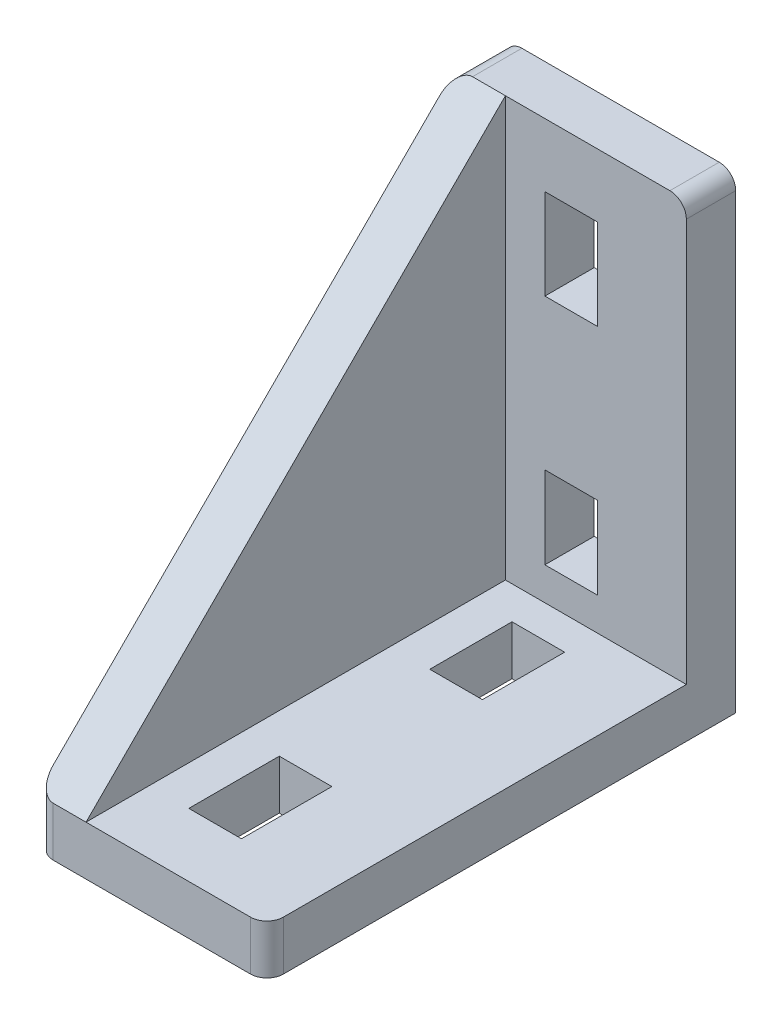
ISO-10303-21;
HEADER;
FILE_DESCRIPTION(('STEP AP214'),'2;1');
FILE_NAME('part.step','',(''),(''),'','','');
FILE_SCHEMA(('AUTOMOTIVE_DESIGN { 1 0 10303 214 1 1 1 1 }'));
ENDSEC;
DATA;
#1=APPLICATION_CONTEXT('core data for automotive mechanical design processes');
#2=APPLICATION_PROTOCOL_DEFINITION('international standard','automotive_design',2000,#1);
#3=PRODUCT_CONTEXT('',#1,'mechanical');
#4=PRODUCT('Part','Part','',(#3));
#5=PRODUCT_RELATED_PRODUCT_CATEGORY('part','',(#4));
#6=PRODUCT_DEFINITION_FORMATION('','',#4);
#7=PRODUCT_DEFINITION_CONTEXT('part definition',#1,'design');
#8=PRODUCT_DEFINITION('design','',#6,#7);
#9=PRODUCT_DEFINITION_SHAPE('','',#8);
#10=(LENGTH_UNIT() NAMED_UNIT(*) SI_UNIT(.MILLI.,.METRE.));
#11=(NAMED_UNIT(*) PLANE_ANGLE_UNIT() SI_UNIT($,.RADIAN.));
#12=(NAMED_UNIT(*) SI_UNIT($,.STERADIAN.) SOLID_ANGLE_UNIT());
#13=UNCERTAINTY_MEASURE_WITH_UNIT(LENGTH_MEASURE(1.E-05),#10,'distance_accuracy_value','');
#14=(GEOMETRIC_REPRESENTATION_CONTEXT(3) GLOBAL_UNCERTAINTY_ASSIGNED_CONTEXT((#13)) GLOBAL_UNIT_ASSIGNED_CONTEXT((#10,
#11,#12)) REPRESENTATION_CONTEXT('',''));
#15=CARTESIAN_POINT('',(0.,0.,0.));
#16=DIRECTION('',(0.,0.,1.));
#17=DIRECTION('',(1.,0.,0.));
#18=AXIS2_PLACEMENT_3D('',#15,#16,#17);
#19=CARTESIAN_POINT('',(28.,3.,3.));
#20=DIRECTION('',(0.,-0.707106781186547,-0.707106781186547));
#21=DIRECTION('',(0.,0.707106781186548,-0.707106781186548));
#22=AXIS2_PLACEMENT_3D('',#19,#20,#21);
#23=PLANE('',#22);
#24=DIRECTION('',(-1.,0.,0.));
#25=VECTOR('',#24,1.);
#26=CARTESIAN_POINT('',(28.,57.,-51.));
#27=LINE('',#26,#25);
#28=CARTESIAN_POINT('',(6.,57.,-51.));
#29=VERTEX_POINT('',#28);
#30=CARTESIAN_POINT('',(2.,57.,-51.));
#31=VERTEX_POINT('',#30);
#32=EDGE_CURVE('E468',#29,#31,#27,.T.);
#33=ORIENTED_EDGE('',*,*,#32,.T.);
#34=CARTESIAN_POINT('',(2.,55.,-49.));
#35=DIRECTION('',(0.,-0.707106781186547,-0.707106781186547));
#36=DIRECTION('',(0.,-0.707106781186548,0.707106781186548));
#37=AXIS2_PLACEMENT_3D('',#34,#35,#36);
#38=ELLIPSE('',#37,2.82842712474619,2.);
#39=CARTESIAN_POINT('',(0.,55.,-49.));
#40=VERTEX_POINT('',#39);
#41=EDGE_CURVE('E482',#31,#40,#38,.F.);
#42=ORIENTED_EDGE('',*,*,#41,.T.);
#43=DIRECTION('',(0.,-0.707106781186548,0.707106781186548));
#44=VECTOR('',#43,1.);
#45=CARTESIAN_POINT('',(0.,3.,3.));
#46=LINE('',#45,#44);
#47=CARTESIAN_POINT('',(0.,8.,-2.));
#48=VERTEX_POINT('',#47);
#49=EDGE_CURVE('E421',#40,#48,#46,.T.);
#50=ORIENTED_EDGE('',*,*,#49,.T.);
#51=CARTESIAN_POINT('',(2.,8.,-2.));
#52=DIRECTION('',(0.,-0.707106781186547,-0.707106781186547));
#53=DIRECTION('',(0.,-0.707106781186548,0.707106781186548));
#54=AXIS2_PLACEMENT_3D('',#51,#52,#53);
#55=ELLIPSE('',#54,2.82842712474619,2.);
#56=CARTESIAN_POINT('',(2.,5.99999999999999,0.));
#57=VERTEX_POINT('',#56);
#58=EDGE_CURVE('E479',#48,#57,#55,.F.);
#59=ORIENTED_EDGE('',*,*,#58,.T.);
#60=DIRECTION('',(-1.,0.,0.));
#61=VECTOR('',#60,1.);
#62=CARTESIAN_POINT('',(28.,5.99999999999999,0.));
#63=LINE('',#62,#61);
#64=CARTESIAN_POINT('',(6.,5.99999999999999,0.));
#65=VERTEX_POINT('',#64);
#66=EDGE_CURVE('E464',#65,#57,#63,.T.);
#67=ORIENTED_EDGE('',*,*,#66,.F.);
#68=DIRECTION('',(0.,-0.707106781186548,0.707106781186548));
#69=VECTOR('',#68,1.);
#70=CARTESIAN_POINT('',(6.,3.,3.));
#71=LINE('',#70,#69);
#72=EDGE_CURVE('E371',#29,#65,#71,.T.);
#73=ORIENTED_EDGE('',*,*,#72,.F.);
#74=EDGE_LOOP('',(#33,#42,#50,#59,#67,#73));
#75=FACE_BOUND('',#74,.T.);
#76=ADVANCED_FACE('F49',(#75),#23,.F.);
#77=CARTESIAN_POINT('',(28.,57.,0.));
#78=DIRECTION('',(0.,-1.,0.));
#79=DIRECTION('',(0.,0.,-1.));
#80=AXIS2_PLACEMENT_3D('',#77,#78,#79);
#81=PLANE('',#80);
#82=DIRECTION('',(-1.,0.,0.));
#83=VECTOR('',#82,1.);
#84=CARTESIAN_POINT('',(28.,57.,-57.));
#85=LINE('',#84,#83);
#86=CARTESIAN_POINT('',(26.,57.,-57.));
#87=VERTEX_POINT('',#86);
#88=CARTESIAN_POINT('',(2.,57.,-57.));
#89=VERTEX_POINT('',#88);
#90=EDGE_CURVE('E443',#87,#89,#85,.T.);
#91=ORIENTED_EDGE('',*,*,#90,.T.);
#92=DIRECTION('',(0.,0.,1.));
#93=VECTOR('',#92,1.);
#94=CARTESIAN_POINT('',(2.,57.,0.));
#95=LINE('',#94,#93);
#96=EDGE_CURVE('E475',#89,#31,#95,.T.);
#97=ORIENTED_EDGE('',*,*,#96,.T.);
#98=ORIENTED_EDGE('',*,*,#32,.F.);
#99=CARTESIAN_POINT('',(26.,57.,-51.));
#100=VERTEX_POINT('',#99);
#101=EDGE_CURVE('E469',#100,#29,#27,.T.);
#102=ORIENTED_EDGE('',*,*,#101,.F.);
#103=DIRECTION('',(0.,0.,1.));
#104=VECTOR('',#103,1.);
#105=CARTESIAN_POINT('',(26.,57.,-57.));
#106=LINE('',#105,#104);
#107=EDGE_CURVE('E472',#100,#87,#106,.F.);
#108=ORIENTED_EDGE('',*,*,#107,.T.);
#109=EDGE_LOOP('',(#91,#97,#98,#102,#108));
#110=FACE_BOUND('',#109,.T.);
#111=ADVANCED_FACE('F537',(#110),#81,.F.);
#112=CARTESIAN_POINT('',(28.,0.,0.));
#113=DIRECTION('',(0.,0.,-1.));
#114=DIRECTION('',(-1.,0.,0.));
#115=AXIS2_PLACEMENT_3D('',#112,#113,#114);
#116=PLANE('',#115);
#117=ORIENTED_EDGE('',*,*,#66,.T.);
#118=DIRECTION('',(0.,-1.,0.));
#119=VECTOR('',#118,1.);
#120=CARTESIAN_POINT('',(2.,0.,0.));
#121=LINE('',#120,#119);
#122=CARTESIAN_POINT('',(2.,0.,0.));
#123=VERTEX_POINT('',#122);
#124=EDGE_CURVE('E510',#57,#123,#121,.T.);
#125=ORIENTED_EDGE('',*,*,#124,.T.);
#126=DIRECTION('',(-1.,0.,0.));
#127=VECTOR('',#126,1.);
#128=CARTESIAN_POINT('',(28.,0.,0.));
#129=LINE('',#128,#127);
#130=CARTESIAN_POINT('',(26.,0.,0.));
#131=VERTEX_POINT('',#130);
#132=EDGE_CURVE('E460',#131,#123,#129,.T.);
#133=ORIENTED_EDGE('',*,*,#132,.F.);
#134=DIRECTION('',(0.,-1.,0.));
#135=VECTOR('',#134,1.);
#136=CARTESIAN_POINT('',(26.,5.99999999999999,0.));
#137=LINE('',#136,#135);
#138=CARTESIAN_POINT('',(26.,5.99999999999999,0.));
#139=VERTEX_POINT('',#138);
#140=EDGE_CURVE('E65',#131,#139,#137,.F.);
#141=ORIENTED_EDGE('',*,*,#140,.T.);
#142=EDGE_CURVE('E465',#139,#65,#63,.T.);
#143=ORIENTED_EDGE('',*,*,#142,.T.);
#144=EDGE_LOOP('',(#117,#125,#133,#141,#143));
#145=FACE_BOUND('',#144,.T.);
#146=ADVANCED_FACE('F530',(#145),#116,.F.);
#147=CARTESIAN_POINT('',(28.,0.,0.));
#148=DIRECTION('',(0.,1.,0.));
#149=DIRECTION('',(0.,0.,1.));
#150=AXIS2_PLACEMENT_3D('',#147,#148,#149);
#151=PLANE('',#150);
#152=DIRECTION('',(1.,0.,0.));
#153=VECTOR('',#152,1.);
#154=CARTESIAN_POINT('',(10.8,0.,-47.));
#155=LINE('',#154,#153);
#156=CARTESIAN_POINT('',(10.8,0.,-47.));
#157=VERTEX_POINT('',#156);
#158=CARTESIAN_POINT('',(17.2,0.,-47.));
#159=VERTEX_POINT('',#158);
#160=EDGE_CURVE('E257',#157,#159,#155,.T.);
#161=ORIENTED_EDGE('',*,*,#160,.F.);
#162=DIRECTION('',(0.,0.,-1.));
#163=VECTOR('',#162,1.);
#164=CARTESIAN_POINT('',(10.8,0.,-47.));
#165=LINE('',#164,#163);
#166=CARTESIAN_POINT('',(10.8,0.,-37.));
#167=VERTEX_POINT('',#166);
#168=EDGE_CURVE('E233',#167,#157,#165,.T.);
#169=ORIENTED_EDGE('',*,*,#168,.F.);
#170=DIRECTION('',(-1.,0.,0.));
#171=VECTOR('',#170,1.);
#172=CARTESIAN_POINT('',(10.8,0.,-37.));
#173=LINE('',#172,#171);
#174=CARTESIAN_POINT('',(17.2,0.,-37.));
#175=VERTEX_POINT('',#174);
#176=EDGE_CURVE('E246',#175,#167,#173,.T.);
#177=ORIENTED_EDGE('',*,*,#176,.F.);
#178=DIRECTION('',(0.,0.,1.));
#179=VECTOR('',#178,1.);
#180=CARTESIAN_POINT('',(17.2,0.,-47.));
#181=LINE('',#180,#179);
#182=EDGE_CURVE('E264',#159,#175,#181,.T.);
#183=ORIENTED_EDGE('',*,*,#182,.F.);
#184=EDGE_LOOP('',(#161,#169,#177,#183));
#185=FACE_BOUND('',#184,.T.);
#186=DIRECTION('',(1.,0.,0.));
#187=VECTOR('',#186,1.);
#188=CARTESIAN_POINT('',(10.8,0.,-18.7));
#189=LINE('',#188,#187);
#190=CARTESIAN_POINT('',(10.8,0.,-18.7));
#191=VERTEX_POINT('',#190);
#192=CARTESIAN_POINT('',(17.2,0.,-18.7));
#193=VERTEX_POINT('',#192);
#194=EDGE_CURVE('E320',#191,#193,#189,.T.);
#195=ORIENTED_EDGE('',*,*,#194,.F.);
#196=DIRECTION('',(0.,0.,-1.));
#197=VECTOR('',#196,1.);
#198=CARTESIAN_POINT('',(10.8,0.,-18.7));
#199=LINE('',#198,#197);
#200=CARTESIAN_POINT('',(10.8,0.,-7.70000000000001));
#201=VERTEX_POINT('',#200);
#202=EDGE_CURVE('E316',#201,#191,#199,.T.);
#203=ORIENTED_EDGE('',*,*,#202,.F.);
#204=DIRECTION('',(-1.,0.,0.));
#205=VECTOR('',#204,1.);
#206=CARTESIAN_POINT('',(10.8,0.,-7.70000000000001));
#207=LINE('',#206,#205);
#208=CARTESIAN_POINT('',(17.2,0.,-7.70000000000001));
#209=VERTEX_POINT('',#208);
#210=EDGE_CURVE('E284',#209,#201,#207,.T.);
#211=ORIENTED_EDGE('',*,*,#210,.F.);
#212=DIRECTION('',(0.,0.,1.));
#213=VECTOR('',#212,1.);
#214=CARTESIAN_POINT('',(17.2,0.,-18.7));
#215=LINE('',#214,#213);
#216=EDGE_CURVE('E324',#193,#209,#215,.T.);
#217=ORIENTED_EDGE('',*,*,#216,.F.);
#218=EDGE_LOOP('',(#195,#203,#211,#217));
#219=FACE_BOUND('',#218,.T.);
#220=ORIENTED_EDGE('',*,*,#132,.T.);
#221=CARTESIAN_POINT('',(2.,0.,-2.));
#222=DIRECTION('',(0.,1.,0.));
#223=DIRECTION('',(0.,0.,1.));
#224=AXIS2_PLACEMENT_3D('',#221,#222,#223);
#225=CIRCLE('',#224,2.);
#226=CARTESIAN_POINT('',(0.,0.,-2.));
#227=VERTEX_POINT('',#226);
#228=EDGE_CURVE('E58',#123,#227,#225,.F.);
#229=ORIENTED_EDGE('',*,*,#228,.T.);
#230=DIRECTION('',(0.,0.,-1.));
#231=VECTOR('',#230,1.);
#232=CARTESIAN_POINT('',(0.,0.,0.));
#233=LINE('',#232,#231);
#234=CARTESIAN_POINT('',(0.,0.,-57.));
#235=VERTEX_POINT('',#234);
#236=EDGE_CURVE('E447',#227,#235,#233,.T.);
#237=ORIENTED_EDGE('',*,*,#236,.T.);
#238=DIRECTION('',(-1.,0.,0.));
#239=VECTOR('',#238,1.);
#240=CARTESIAN_POINT('',(28.,0.,-57.));
#241=LINE('',#240,#239);
#242=CARTESIAN_POINT('',(28.,0.,-57.));
#243=VERTEX_POINT('',#242);
#244=EDGE_CURVE('E456',#243,#235,#241,.T.);
#245=ORIENTED_EDGE('',*,*,#244,.F.);
#246=DIRECTION('',(0.,0.,-1.));
#247=VECTOR('',#246,1.);
#248=CARTESIAN_POINT('',(28.,0.,0.));
#249=LINE('',#248,#247);
#250=CARTESIAN_POINT('',(28.,0.,-2.));
#251=VERTEX_POINT('',#250);
#252=EDGE_CURVE('E435',#251,#243,#249,.T.);
#253=ORIENTED_EDGE('',*,*,#252,.F.);
#254=CARTESIAN_POINT('',(26.,0.,-2.));
#255=DIRECTION('',(0.,1.,0.));
#256=DIRECTION('',(0.,0.,1.));
#257=AXIS2_PLACEMENT_3D('',#254,#255,#256);
#258=CIRCLE('',#257,2.);
#259=EDGE_CURVE('E513',#251,#131,#258,.F.);
#260=ORIENTED_EDGE('',*,*,#259,.T.);
#261=EDGE_LOOP('',(#220,#229,#237,#245,#253,#260));
#262=FACE_BOUND('',#261,.T.);
#263=ADVANCED_FACE('F254',(#185,#219,#262),#151,.F.);
#264=CARTESIAN_POINT('',(28.,0.,-57.));
#265=DIRECTION('',(0.,0.,1.));
#266=DIRECTION('',(1.,0.,0.));
#267=AXIS2_PLACEMENT_3D('',#264,#265,#266);
#268=PLANE('',#267);
#269=DIRECTION('',(1.,0.,0.));
#270=VECTOR('',#269,1.);
#271=CARTESIAN_POINT('',(10.8,49.3,-57.));
#272=LINE('',#271,#270);
#273=CARTESIAN_POINT('',(10.8,49.3,-57.));
#274=VERTEX_POINT('',#273);
#275=CARTESIAN_POINT('',(17.2,49.3,-57.));
#276=VERTEX_POINT('',#275);
#277=EDGE_CURVE('E330',#274,#276,#272,.T.);
#278=ORIENTED_EDGE('',*,*,#277,.F.);
#279=DIRECTION('',(0.,1.,0.));
#280=VECTOR('',#279,1.);
#281=CARTESIAN_POINT('',(10.8,49.3,-57.));
#282=LINE('',#281,#280);
#283=CARTESIAN_POINT('',(10.8,38.3,-57.));
#284=VERTEX_POINT('',#283);
#285=EDGE_CURVE('E335',#284,#274,#282,.T.);
#286=ORIENTED_EDGE('',*,*,#285,.F.);
#287=DIRECTION('',(-1.,0.,0.));
#288=VECTOR('',#287,1.);
#289=CARTESIAN_POINT('',(10.8,38.3,-57.));
#290=LINE('',#289,#288);
#291=CARTESIAN_POINT('',(17.2,38.3,-57.));
#292=VERTEX_POINT('',#291);
#293=EDGE_CURVE('E358',#292,#284,#290,.T.);
#294=ORIENTED_EDGE('',*,*,#293,.F.);
#295=DIRECTION('',(0.,-1.,0.));
#296=VECTOR('',#295,1.);
#297=CARTESIAN_POINT('',(17.2,49.3,-57.));
#298=LINE('',#297,#296);
#299=EDGE_CURVE('E327',#276,#292,#298,.T.);
#300=ORIENTED_EDGE('',*,*,#299,.F.);
#301=EDGE_LOOP('',(#278,#286,#294,#300));
#302=FACE_BOUND('',#301,.T.);
#303=DIRECTION('',(1.,0.,0.));
#304=VECTOR('',#303,1.);
#305=CARTESIAN_POINT('',(10.8,20.,-57.));
#306=LINE('',#305,#304);
#307=CARTESIAN_POINT('',(10.8,20.,-57.));
#308=VERTEX_POINT('',#307);
#309=CARTESIAN_POINT('',(17.2,20.,-57.));
#310=VERTEX_POINT('',#309);
#311=EDGE_CURVE('E407',#308,#310,#306,.T.);
#312=ORIENTED_EDGE('',*,*,#311,.F.);
#313=DIRECTION('',(0.,1.,0.));
#314=VECTOR('',#313,1.);
#315=CARTESIAN_POINT('',(10.8,20.,-57.));
#316=LINE('',#315,#314);
#317=CARTESIAN_POINT('',(10.8,10.,-57.));
#318=VERTEX_POINT('',#317);
#319=EDGE_CURVE('E403',#318,#308,#316,.T.);
#320=ORIENTED_EDGE('',*,*,#319,.F.);
#321=DIRECTION('',(-1.,0.,0.));
#322=VECTOR('',#321,1.);
#323=CARTESIAN_POINT('',(10.8,10.,-57.));
#324=LINE('',#323,#322);
#325=CARTESIAN_POINT('',(17.2,10.,-57.));
#326=VERTEX_POINT('',#325);
#327=EDGE_CURVE('E251',#326,#318,#324,.T.);
#328=ORIENTED_EDGE('',*,*,#327,.F.);
#329=DIRECTION('',(0.,-1.,0.));
#330=VECTOR('',#329,1.);
#331=CARTESIAN_POINT('',(17.2,20.,-57.));
#332=LINE('',#331,#330);
#333=EDGE_CURVE('E331',#310,#326,#332,.T.);
#334=ORIENTED_EDGE('',*,*,#333,.F.);
#335=EDGE_LOOP('',(#312,#320,#328,#334));
#336=FACE_BOUND('',#335,.T.);
#337=DIRECTION('',(0.,1.,0.));
#338=VECTOR('',#337,1.);
#339=CARTESIAN_POINT('',(0.,0.,-57.));
#340=LINE('',#339,#338);
#341=CARTESIAN_POINT('',(0.,55.,-57.));
#342=VERTEX_POINT('',#341);
#343=EDGE_CURVE('E439',#235,#342,#340,.T.);
#344=ORIENTED_EDGE('',*,*,#343,.T.);
#345=CARTESIAN_POINT('',(2.,55.,-57.));
#346=DIRECTION('',(0.,0.,1.));
#347=DIRECTION('',(1.,0.,0.));
#348=AXIS2_PLACEMENT_3D('',#345,#346,#347);
#349=CIRCLE('',#348,2.);
#350=EDGE_CURVE('E494',#342,#89,#349,.F.);
#351=ORIENTED_EDGE('',*,*,#350,.T.);
#352=ORIENTED_EDGE('',*,*,#90,.F.);
#353=CARTESIAN_POINT('',(26.,55.,-57.));
#354=DIRECTION('',(0.,0.,1.));
#355=DIRECTION('',(1.,0.,0.));
#356=AXIS2_PLACEMENT_3D('',#353,#354,#355);
#357=CIRCLE('',#356,2.);
#358=CARTESIAN_POINT('',(28.,55.,-57.));
#359=VERTEX_POINT('',#358);
#360=EDGE_CURVE('E491',#87,#359,#357,.F.);
#361=ORIENTED_EDGE('',*,*,#360,.T.);
#362=DIRECTION('',(0.,1.,0.));
#363=VECTOR('',#362,1.);
#364=CARTESIAN_POINT('',(28.,0.,-57.));
#365=LINE('',#364,#363);
#366=EDGE_CURVE('E438',#243,#359,#365,.T.);
#367=ORIENTED_EDGE('',*,*,#366,.F.);
#368=ORIENTED_EDGE('',*,*,#244,.T.);
#369=EDGE_LOOP('',(#344,#351,#352,#361,#367,#368));
#370=FACE_BOUND('',#369,.T.);
#371=ADVANCED_FACE('F546',(#302,#336,#370),#268,.F.);
#372=CARTESIAN_POINT('',(28.,0.,0.));
#373=DIRECTION('',(1.,0.,0.));
#374=DIRECTION('',(0.,0.,-1.));
#375=AXIS2_PLACEMENT_3D('',#372,#373,#374);
#376=PLANE('',#375);
#377=ORIENTED_EDGE('',*,*,#366,.T.);
#378=DIRECTION('',(0.,0.,1.));
#379=VECTOR('',#378,1.);
#380=CARTESIAN_POINT('',(28.,55.,-51.));
#381=LINE('',#380,#379);
#382=CARTESIAN_POINT('',(28.,55.,-51.));
#383=VERTEX_POINT('',#382);
#384=EDGE_CURVE('E501',#359,#383,#381,.T.);
#385=ORIENTED_EDGE('',*,*,#384,.T.);
#386=DIRECTION('',(0.,1.,0.));
#387=VECTOR('',#386,1.);
#388=CARTESIAN_POINT('',(28.,0.,-51.));
#389=LINE('',#388,#387);
#390=CARTESIAN_POINT('',(28.,6.,-51.));
#391=VERTEX_POINT('',#390);
#392=EDGE_CURVE('E422',#391,#383,#389,.T.);
#393=ORIENTED_EDGE('',*,*,#392,.F.);
#394=DIRECTION('',(0.,0.,-1.));
#395=VECTOR('',#394,1.);
#396=CARTESIAN_POINT('',(28.,6.,0.));
#397=LINE('',#396,#395);
#398=CARTESIAN_POINT('',(28.,6.,-2.));
#399=VERTEX_POINT('',#398);
#400=EDGE_CURVE('E426',#399,#391,#397,.T.);
#401=ORIENTED_EDGE('',*,*,#400,.F.);
#402=DIRECTION('',(0.,-1.,0.));
#403=VECTOR('',#402,1.);
#404=CARTESIAN_POINT('',(28.,0.,-2.));
#405=LINE('',#404,#403);
#406=EDGE_CURVE('E497',#399,#251,#405,.T.);
#407=ORIENTED_EDGE('',*,*,#406,.T.);
#408=ORIENTED_EDGE('',*,*,#252,.T.);
#409=EDGE_LOOP('',(#377,#385,#393,#401,#407,#408));
#410=FACE_BOUND('',#409,.T.);
#411=ADVANCED_FACE('F550',(#410),#376,.T.);
#412=CARTESIAN_POINT('',(0.,0.,0.));
#413=DIRECTION('',(1.,0.,0.));
#414=DIRECTION('',(0.,0.,-1.));
#415=AXIS2_PLACEMENT_3D('',#412,#413,#414);
#416=PLANE('',#415);
#417=ORIENTED_EDGE('',*,*,#49,.F.);
#418=DIRECTION('',(0.,0.,1.));
#419=VECTOR('',#418,1.);
#420=CARTESIAN_POINT('',(0.,55.,0.));
#421=LINE('',#420,#419);
#422=EDGE_CURVE('E488',#40,#342,#421,.F.);
#423=ORIENTED_EDGE('',*,*,#422,.T.);
#424=ORIENTED_EDGE('',*,*,#343,.F.);
#425=ORIENTED_EDGE('',*,*,#236,.F.);
#426=DIRECTION('',(0.,-1.,0.));
#427=VECTOR('',#426,1.);
#428=CARTESIAN_POINT('',(0.,0.,-2.));
#429=LINE('',#428,#427);
#430=EDGE_CURVE('E485',#227,#48,#429,.F.);
#431=ORIENTED_EDGE('',*,*,#430,.T.);
#432=EDGE_LOOP('',(#417,#423,#424,#425,#431));
#433=FACE_BOUND('',#432,.T.);
#434=ADVANCED_FACE('F522',(#433),#416,.F.);
#435=CARTESIAN_POINT('',(28.,6.,0.));
#436=DIRECTION('',(0.,1.,0.));
#437=DIRECTION('',(0.,0.,1.));
#438=AXIS2_PLACEMENT_3D('',#435,#436,#437);
#439=PLANE('',#438);
#440=DIRECTION('',(0.,0.,1.));
#441=VECTOR('',#440,1.);
#442=CARTESIAN_POINT('',(10.8,6.,-47.));
#443=LINE('',#442,#441);
#444=CARTESIAN_POINT('',(10.8,6.,-47.));
#445=VERTEX_POINT('',#444);
#446=CARTESIAN_POINT('',(10.8,6.,-37.));
#447=VERTEX_POINT('',#446);
#448=EDGE_CURVE('E236',#445,#447,#443,.T.);
#449=ORIENTED_EDGE('',*,*,#448,.F.);
#450=DIRECTION('',(-1.,0.,0.));
#451=VECTOR('',#450,1.);
#452=CARTESIAN_POINT('',(10.8,6.,-47.));
#453=LINE('',#452,#451);
#454=CARTESIAN_POINT('',(17.2,6.,-47.));
#455=VERTEX_POINT('',#454);
#456=EDGE_CURVE('E242',#455,#445,#453,.T.);
#457=ORIENTED_EDGE('',*,*,#456,.F.);
#458=DIRECTION('',(0.,0.,-1.));
#459=VECTOR('',#458,1.);
#460=CARTESIAN_POINT('',(17.2,6.,-47.));
#461=LINE('',#460,#459);
#462=CARTESIAN_POINT('',(17.2,6.,-37.));
#463=VERTEX_POINT('',#462);
#464=EDGE_CURVE('E270',#463,#455,#461,.T.);
#465=ORIENTED_EDGE('',*,*,#464,.F.);
#466=DIRECTION('',(1.,0.,0.));
#467=VECTOR('',#466,1.);
#468=CARTESIAN_POINT('',(10.8,6.,-37.));
#469=LINE('',#468,#467);
#470=EDGE_CURVE('E262',#447,#463,#469,.T.);
#471=ORIENTED_EDGE('',*,*,#470,.F.);
#472=EDGE_LOOP('',(#449,#457,#465,#471));
#473=FACE_BOUND('',#472,.T.);
#474=DIRECTION('',(0.,0.,1.));
#475=VECTOR('',#474,1.);
#476=CARTESIAN_POINT('',(10.8,6.,-18.7));
#477=LINE('',#476,#475);
#478=CARTESIAN_POINT('',(10.8,6.,-18.7));
#479=VERTEX_POINT('',#478);
#480=CARTESIAN_POINT('',(10.8,6.,-7.70000000000001));
#481=VERTEX_POINT('',#480);
#482=EDGE_CURVE('E313',#479,#481,#477,.T.);
#483=ORIENTED_EDGE('',*,*,#482,.F.);
#484=DIRECTION('',(-1.,0.,0.));
#485=VECTOR('',#484,1.);
#486=CARTESIAN_POINT('',(10.8,6.,-18.7));
#487=LINE('',#486,#485);
#488=CARTESIAN_POINT('',(17.2,6.,-18.7));
#489=VERTEX_POINT('',#488);
#490=EDGE_CURVE('E293',#489,#479,#487,.T.);
#491=ORIENTED_EDGE('',*,*,#490,.F.);
#492=DIRECTION('',(0.,0.,-1.));
#493=VECTOR('',#492,1.);
#494=CARTESIAN_POINT('',(17.2,6.,-18.7));
#495=LINE('',#494,#493);
#496=CARTESIAN_POINT('',(17.2,6.,-7.70000000000001));
#497=VERTEX_POINT('',#496);
#498=EDGE_CURVE('E305',#497,#489,#495,.T.);
#499=ORIENTED_EDGE('',*,*,#498,.F.);
#500=DIRECTION('',(1.,0.,0.));
#501=VECTOR('',#500,1.);
#502=CARTESIAN_POINT('',(10.8,6.,-7.70000000000001));
#503=LINE('',#502,#501);
#504=EDGE_CURVE('E309',#481,#497,#503,.T.);
#505=ORIENTED_EDGE('',*,*,#504,.F.);
#506=EDGE_LOOP('',(#483,#491,#499,#505));
#507=FACE_BOUND('',#506,.T.);
#508=ORIENTED_EDGE('',*,*,#142,.F.);
#509=CARTESIAN_POINT('',(26.,6.,-2.));
#510=DIRECTION('',(0.,1.,0.));
#511=DIRECTION('',(0.,0.,1.));
#512=AXIS2_PLACEMENT_3D('',#509,#510,#511);
#513=CIRCLE('',#512,2.);
#514=EDGE_CURVE('E11',#139,#399,#513,.T.);
#515=ORIENTED_EDGE('',*,*,#514,.T.);
#516=ORIENTED_EDGE('',*,*,#400,.T.);
#517=DIRECTION('',(-1.,0.,0.));
#518=VECTOR('',#517,1.);
#519=CARTESIAN_POINT('',(28.,6.,-51.));
#520=LINE('',#519,#518);
#521=CARTESIAN_POINT('',(6.,6.,-51.));
#522=VERTEX_POINT('',#521);
#523=EDGE_CURVE('E417',#391,#522,#520,.T.);
#524=ORIENTED_EDGE('',*,*,#523,.T.);
#525=DIRECTION('',(0.,0.,-1.));
#526=VECTOR('',#525,1.);
#527=CARTESIAN_POINT('',(6.,6.,0.));
#528=LINE('',#527,#526);
#529=EDGE_CURVE('E413',#65,#522,#528,.T.);
#530=ORIENTED_EDGE('',*,*,#529,.F.);
#531=EDGE_LOOP('',(#508,#515,#516,#524,#530));
#532=FACE_BOUND('',#531,.T.);
#533=ADVANCED_FACE('F558',(#473,#507,#532),#439,.T.);
#534=CARTESIAN_POINT('',(28.,0.,-51.));
#535=DIRECTION('',(0.,0.,1.));
#536=DIRECTION('',(1.,0.,0.));
#537=AXIS2_PLACEMENT_3D('',#534,#535,#536);
#538=PLANE('',#537);
#539=DIRECTION('',(0.,-1.,0.));
#540=VECTOR('',#539,1.);
#541=CARTESIAN_POINT('',(10.8,49.3,-51.));
#542=LINE('',#541,#540);
#543=CARTESIAN_POINT('',(10.8,49.3,-51.));
#544=VERTEX_POINT('',#543);
#545=CARTESIAN_POINT('',(10.8,38.3,-51.));
#546=VERTEX_POINT('',#545);
#547=EDGE_CURVE('E339',#544,#546,#542,.T.);
#548=ORIENTED_EDGE('',*,*,#547,.F.);
#549=DIRECTION('',(-1.,0.,0.));
#550=VECTOR('',#549,1.);
#551=CARTESIAN_POINT('',(10.8,49.3,-51.));
#552=LINE('',#551,#550);
#553=CARTESIAN_POINT('',(17.2,49.3,-51.));
#554=VERTEX_POINT('',#553);
#555=EDGE_CURVE('E350',#554,#544,#552,.T.);
#556=ORIENTED_EDGE('',*,*,#555,.F.);
#557=DIRECTION('',(0.,1.,0.));
#558=VECTOR('',#557,1.);
#559=CARTESIAN_POINT('',(17.2,49.3,-51.));
#560=LINE('',#559,#558);
#561=CARTESIAN_POINT('',(17.2,38.3,-51.));
#562=VERTEX_POINT('',#561);
#563=EDGE_CURVE('E346',#562,#554,#560,.T.);
#564=ORIENTED_EDGE('',*,*,#563,.F.);
#565=DIRECTION('',(1.,0.,0.));
#566=VECTOR('',#565,1.);
#567=CARTESIAN_POINT('',(10.8,38.3,-51.));
#568=LINE('',#567,#566);
#569=EDGE_CURVE('E342',#546,#562,#568,.T.);
#570=ORIENTED_EDGE('',*,*,#569,.F.);
#571=EDGE_LOOP('',(#548,#556,#564,#570));
#572=FACE_BOUND('',#571,.T.);
#573=DIRECTION('',(0.,-1.,0.));
#574=VECTOR('',#573,1.);
#575=CARTESIAN_POINT('',(10.8,20.,-51.));
#576=LINE('',#575,#574);
#577=CARTESIAN_POINT('',(10.8,20.,-51.));
#578=VERTEX_POINT('',#577);
#579=CARTESIAN_POINT('',(10.8,10.,-51.));
#580=VERTEX_POINT('',#579);
#581=EDGE_CURVE('E400',#578,#580,#576,.T.);
#582=ORIENTED_EDGE('',*,*,#581,.F.);
#583=DIRECTION('',(-1.,0.,0.));
#584=VECTOR('',#583,1.);
#585=CARTESIAN_POINT('',(10.8,20.,-51.));
#586=LINE('',#585,#584);
#587=CARTESIAN_POINT('',(17.2,20.,-51.));
#588=VERTEX_POINT('',#587);
#589=EDGE_CURVE('E380',#588,#578,#586,.T.);
#590=ORIENTED_EDGE('',*,*,#589,.F.);
#591=DIRECTION('',(0.,1.,0.));
#592=VECTOR('',#591,1.);
#593=CARTESIAN_POINT('',(17.2,20.,-51.));
#594=LINE('',#593,#592);
#595=CARTESIAN_POINT('',(17.2,10.,-51.));
#596=VERTEX_POINT('',#595);
#597=EDGE_CURVE('E392',#596,#588,#594,.T.);
#598=ORIENTED_EDGE('',*,*,#597,.F.);
#599=DIRECTION('',(1.,0.,0.));
#600=VECTOR('',#599,1.);
#601=CARTESIAN_POINT('',(10.8,10.,-51.));
#602=LINE('',#601,#600);
#603=EDGE_CURVE('E396',#580,#596,#602,.T.);
#604=ORIENTED_EDGE('',*,*,#603,.F.);
#605=EDGE_LOOP('',(#582,#590,#598,#604));
#606=FACE_BOUND('',#605,.T.);
#607=ORIENTED_EDGE('',*,*,#392,.T.);
#608=CARTESIAN_POINT('',(26.,55.,-51.));
#609=DIRECTION('',(0.,0.,1.));
#610=DIRECTION('',(1.,0.,0.));
#611=AXIS2_PLACEMENT_3D('',#608,#609,#610);
#612=CIRCLE('',#611,2.);
#613=EDGE_CURVE('E505',#383,#100,#612,.T.);
#614=ORIENTED_EDGE('',*,*,#613,.T.);
#615=ORIENTED_EDGE('',*,*,#101,.T.);
#616=DIRECTION('',(0.,1.,0.));
#617=VECTOR('',#616,1.);
#618=CARTESIAN_POINT('',(6.,0.,-51.));
#619=LINE('',#618,#617);
#620=EDGE_CURVE('E416',#522,#29,#619,.T.);
#621=ORIENTED_EDGE('',*,*,#620,.F.);
#622=ORIENTED_EDGE('',*,*,#523,.F.);
#623=EDGE_LOOP('',(#607,#614,#615,#621,#622));
#624=FACE_BOUND('',#623,.T.);
#625=ADVANCED_FACE('F564',(#572,#606,#624),#538,.T.);
#626=CARTESIAN_POINT('',(6.,0.,0.));
#627=DIRECTION('',(1.,0.,0.));
#628=DIRECTION('',(0.,0.,-1.));
#629=AXIS2_PLACEMENT_3D('',#626,#627,#628);
#630=PLANE('',#629);
#631=ORIENTED_EDGE('',*,*,#72,.T.);
#632=ORIENTED_EDGE('',*,*,#529,.T.);
#633=ORIENTED_EDGE('',*,*,#620,.T.);
#634=EDGE_LOOP('',(#631,#632,#633));
#635=FACE_BOUND('',#634,.T.);
#636=ADVANCED_FACE('F562',(#635),#630,.T.);
#637=CARTESIAN_POINT('',(10.8,20.,-57.001));
#638=DIRECTION('',(-1.,0.,0.));
#639=DIRECTION('',(0.,0.,1.));
#640=AXIS2_PLACEMENT_3D('',#637,#638,#639);
#641=PLANE('',#640);
#642=ORIENTED_EDGE('',*,*,#319,.T.);
#643=DIRECTION('',(0.,0.,1.));
#644=VECTOR('',#643,1.);
#645=CARTESIAN_POINT('',(10.8,20.,-57.001));
#646=LINE('',#645,#644);
#647=EDGE_CURVE('E375',#308,#578,#646,.T.);
#648=ORIENTED_EDGE('',*,*,#647,.T.);
#649=ORIENTED_EDGE('',*,*,#581,.T.);
#650=DIRECTION('',(0.,0.,1.));
#651=VECTOR('',#650,1.);
#652=CARTESIAN_POINT('',(10.8,10.,-57.001));
#653=LINE('',#652,#651);
#654=EDGE_CURVE('E376',#318,#580,#653,.T.);
#655=ORIENTED_EDGE('',*,*,#654,.F.);
#656=EDGE_LOOP('',(#642,#648,#649,#655));
#657=FACE_BOUND('',#656,.T.);
#658=ADVANCED_FACE('F596',(#657),#641,.F.);
#659=CARTESIAN_POINT('',(10.8,20.,-57.001));
#660=DIRECTION('',(0.,1.,0.));
#661=DIRECTION('',(0.,0.,1.));
#662=AXIS2_PLACEMENT_3D('',#659,#660,#661);
#663=PLANE('',#662);
#664=ORIENTED_EDGE('',*,*,#311,.T.);
#665=DIRECTION('',(0.,0.,1.));
#666=VECTOR('',#665,1.);
#667=CARTESIAN_POINT('',(17.2,20.,-57.001));
#668=LINE('',#667,#666);
#669=EDGE_CURVE('E384',#310,#588,#668,.T.);
#670=ORIENTED_EDGE('',*,*,#669,.T.);
#671=ORIENTED_EDGE('',*,*,#589,.T.);
#672=ORIENTED_EDGE('',*,*,#647,.F.);
#673=EDGE_LOOP('',(#664,#670,#671,#672));
#674=FACE_BOUND('',#673,.T.);
#675=ADVANCED_FACE('F603',(#674),#663,.F.);
#676=CARTESIAN_POINT('',(17.2,20.,-57.001));
#677=DIRECTION('',(1.,0.,0.));
#678=DIRECTION('',(0.,0.,-1.));
#679=AXIS2_PLACEMENT_3D('',#676,#677,#678);
#680=PLANE('',#679);
#681=ORIENTED_EDGE('',*,*,#333,.T.);
#682=DIRECTION('',(0.,0.,1.));
#683=VECTOR('',#682,1.);
#684=CARTESIAN_POINT('',(17.2,10.,-57.001));
#685=LINE('',#684,#683);
#686=EDGE_CURVE('E381',#326,#596,#685,.T.);
#687=ORIENTED_EDGE('',*,*,#686,.T.);
#688=ORIENTED_EDGE('',*,*,#597,.T.);
#689=ORIENTED_EDGE('',*,*,#669,.F.);
#690=EDGE_LOOP('',(#681,#687,#688,#689));
#691=FACE_BOUND('',#690,.T.);
#692=ADVANCED_FACE('F606',(#691),#680,.F.);
#693=CARTESIAN_POINT('',(10.8,10.,-57.001));
#694=DIRECTION('',(0.,-1.,0.));
#695=DIRECTION('',(0.,0.,-1.));
#696=AXIS2_PLACEMENT_3D('',#693,#694,#695);
#697=PLANE('',#696);
#698=ORIENTED_EDGE('',*,*,#327,.T.);
#699=ORIENTED_EDGE('',*,*,#654,.T.);
#700=ORIENTED_EDGE('',*,*,#603,.T.);
#701=ORIENTED_EDGE('',*,*,#686,.F.);
#702=EDGE_LOOP('',(#698,#699,#700,#701));
#703=FACE_BOUND('',#702,.T.);
#704=ADVANCED_FACE('F610',(#703),#697,.F.);
#705=CARTESIAN_POINT('',(10.8,49.3,-57.001));
#706=DIRECTION('',(-1.,0.,0.));
#707=DIRECTION('',(0.,0.,1.));
#708=AXIS2_PLACEMENT_3D('',#705,#706,#707);
#709=PLANE('',#708);
#710=ORIENTED_EDGE('',*,*,#285,.T.);
#711=DIRECTION('',(0.,0.,1.));
#712=VECTOR('',#711,1.);
#713=CARTESIAN_POINT('',(10.8,49.3,-57.001));
#714=LINE('',#713,#712);
#715=EDGE_CURVE('E355',#274,#544,#714,.T.);
#716=ORIENTED_EDGE('',*,*,#715,.T.);
#717=ORIENTED_EDGE('',*,*,#547,.T.);
#718=DIRECTION('',(0.,0.,1.));
#719=VECTOR('',#718,1.);
#720=CARTESIAN_POINT('',(10.8,38.3,-57.001));
#721=LINE('',#720,#719);
#722=EDGE_CURVE('E354',#284,#546,#721,.T.);
#723=ORIENTED_EDGE('',*,*,#722,.F.);
#724=EDGE_LOOP('',(#710,#716,#717,#723));
#725=FACE_BOUND('',#724,.T.);
#726=ADVANCED_FACE('F614',(#725),#709,.F.);
#727=CARTESIAN_POINT('',(10.8,49.3,-57.001));
#728=DIRECTION('',(0.,1.,0.));
#729=DIRECTION('',(0.,0.,1.));
#730=AXIS2_PLACEMENT_3D('',#727,#728,#729);
#731=PLANE('',#730);
#732=ORIENTED_EDGE('',*,*,#277,.T.);
#733=DIRECTION('',(0.,0.,1.));
#734=VECTOR('',#733,1.);
#735=CARTESIAN_POINT('',(17.2,49.3,-57.001));
#736=LINE('',#735,#734);
#737=EDGE_CURVE('E359',#276,#554,#736,.T.);
#738=ORIENTED_EDGE('',*,*,#737,.T.);
#739=ORIENTED_EDGE('',*,*,#555,.T.);
#740=ORIENTED_EDGE('',*,*,#715,.F.);
#741=EDGE_LOOP('',(#732,#738,#739,#740));
#742=FACE_BOUND('',#741,.T.);
#743=ADVANCED_FACE('F621',(#742),#731,.F.);
#744=CARTESIAN_POINT('',(17.2,49.3,-57.001));
#745=DIRECTION('',(1.,0.,0.));
#746=DIRECTION('',(0.,0.,-1.));
#747=AXIS2_PLACEMENT_3D('',#744,#745,#746);
#748=PLANE('',#747);
#749=ORIENTED_EDGE('',*,*,#299,.T.);
#750=DIRECTION('',(0.,0.,1.));
#751=VECTOR('',#750,1.);
#752=CARTESIAN_POINT('',(17.2,38.3,-57.001));
#753=LINE('',#752,#751);
#754=EDGE_CURVE('E362',#292,#562,#753,.T.);
#755=ORIENTED_EDGE('',*,*,#754,.T.);
#756=ORIENTED_EDGE('',*,*,#563,.T.);
#757=ORIENTED_EDGE('',*,*,#737,.F.);
#758=EDGE_LOOP('',(#749,#755,#756,#757));
#759=FACE_BOUND('',#758,.T.);
#760=ADVANCED_FACE('F627',(#759),#748,.F.);
#761=CARTESIAN_POINT('',(10.8,38.3,-57.001));
#762=DIRECTION('',(0.,-1.,0.));
#763=DIRECTION('',(0.,0.,-1.));
#764=AXIS2_PLACEMENT_3D('',#761,#762,#763);
#765=PLANE('',#764);
#766=ORIENTED_EDGE('',*,*,#293,.T.);
#767=ORIENTED_EDGE('',*,*,#722,.T.);
#768=ORIENTED_EDGE('',*,*,#569,.T.);
#769=ORIENTED_EDGE('',*,*,#754,.F.);
#770=EDGE_LOOP('',(#766,#767,#768,#769));
#771=FACE_BOUND('',#770,.T.);
#772=ADVANCED_FACE('F623',(#771),#765,.F.);
#773=CARTESIAN_POINT('',(10.8,-0.00100000000000013,-18.7));
#774=DIRECTION('',(-1.,0.,0.));
#775=DIRECTION('',(0.,0.,1.));
#776=AXIS2_PLACEMENT_3D('',#773,#774,#775);
#777=PLANE('',#776);
#778=ORIENTED_EDGE('',*,*,#202,.T.);
#779=DIRECTION('',(0.,1.,0.));
#780=VECTOR('',#779,1.);
#781=CARTESIAN_POINT('',(10.8,-0.00100000000000013,-18.7));
#782=LINE('',#781,#780);
#783=EDGE_CURVE('E288',#191,#479,#782,.T.);
#784=ORIENTED_EDGE('',*,*,#783,.T.);
#785=ORIENTED_EDGE('',*,*,#482,.T.);
#786=DIRECTION('',(0.,1.,0.));
#787=VECTOR('',#786,1.);
#788=CARTESIAN_POINT('',(10.8,-0.00100000000000013,-7.70000000000001));
#789=LINE('',#788,#787);
#790=EDGE_CURVE('E289',#201,#481,#789,.T.);
#791=ORIENTED_EDGE('',*,*,#790,.F.);
#792=EDGE_LOOP('',(#778,#784,#785,#791));
#793=FACE_BOUND('',#792,.T.);
#794=ADVANCED_FACE('F626',(#793),#777,.F.);
#795=CARTESIAN_POINT('',(10.8,-0.00100000000000013,-18.7));
#796=DIRECTION('',(0.,0.,-1.));
#797=DIRECTION('',(-1.,0.,0.));
#798=AXIS2_PLACEMENT_3D('',#795,#796,#797);
#799=PLANE('',#798);
#800=ORIENTED_EDGE('',*,*,#194,.T.);
#801=DIRECTION('',(0.,1.,0.));
#802=VECTOR('',#801,1.);
#803=CARTESIAN_POINT('',(17.2,-0.00100000000000013,-18.7));
#804=LINE('',#803,#802);
#805=EDGE_CURVE('E297',#193,#489,#804,.T.);
#806=ORIENTED_EDGE('',*,*,#805,.T.);
#807=ORIENTED_EDGE('',*,*,#490,.T.);
#808=ORIENTED_EDGE('',*,*,#783,.F.);
#809=EDGE_LOOP('',(#800,#806,#807,#808));
#810=FACE_BOUND('',#809,.T.);
#811=ADVANCED_FACE('F635',(#810),#799,.F.);
#812=CARTESIAN_POINT('',(17.2,-0.00100000000000013,-18.7));
#813=DIRECTION('',(1.,0.,0.));
#814=DIRECTION('',(0.,0.,-1.));
#815=AXIS2_PLACEMENT_3D('',#812,#813,#814);
#816=PLANE('',#815);
#817=ORIENTED_EDGE('',*,*,#216,.T.);
#818=DIRECTION('',(0.,1.,0.));
#819=VECTOR('',#818,1.);
#820=CARTESIAN_POINT('',(17.2,-0.00100000000000013,-7.70000000000001));
#821=LINE('',#820,#819);
#822=EDGE_CURVE('E294',#209,#497,#821,.T.);
#823=ORIENTED_EDGE('',*,*,#822,.T.);
#824=ORIENTED_EDGE('',*,*,#498,.T.);
#825=ORIENTED_EDGE('',*,*,#805,.F.);
#826=EDGE_LOOP('',(#817,#823,#824,#825));
#827=FACE_BOUND('',#826,.T.);
#828=ADVANCED_FACE('F638',(#827),#816,.F.);
#829=CARTESIAN_POINT('',(10.8,-0.00100000000000013,-7.70000000000001));
#830=DIRECTION('',(0.,0.,1.));
#831=DIRECTION('',(1.,0.,0.));
#832=AXIS2_PLACEMENT_3D('',#829,#830,#831);
#833=PLANE('',#832);
#834=ORIENTED_EDGE('',*,*,#210,.T.);
#835=ORIENTED_EDGE('',*,*,#790,.T.);
#836=ORIENTED_EDGE('',*,*,#504,.T.);
#837=ORIENTED_EDGE('',*,*,#822,.F.);
#838=EDGE_LOOP('',(#834,#835,#836,#837));
#839=FACE_BOUND('',#838,.T.);
#840=ADVANCED_FACE('F642',(#839),#833,.F.);
#841=CARTESIAN_POINT('',(10.8,-0.00100000000000013,-47.));
#842=DIRECTION('',(-1.,0.,0.));
#843=DIRECTION('',(0.,0.,1.));
#844=AXIS2_PLACEMENT_3D('',#841,#842,#843);
#845=PLANE('',#844);
#846=ORIENTED_EDGE('',*,*,#168,.T.);
#847=DIRECTION('',(0.,1.,0.));
#848=VECTOR('',#847,1.);
#849=CARTESIAN_POINT('',(10.8,-0.00100000000000013,-47.));
#850=LINE('',#849,#848);
#851=EDGE_CURVE('E252',#157,#445,#850,.T.);
#852=ORIENTED_EDGE('',*,*,#851,.T.);
#853=ORIENTED_EDGE('',*,*,#448,.T.);
#854=DIRECTION('',(0.,1.,0.));
#855=VECTOR('',#854,1.);
#856=CARTESIAN_POINT('',(10.8,-0.00100000000000013,-37.));
#857=LINE('',#856,#855);
#858=EDGE_CURVE('E229',#167,#447,#857,.T.);
#859=ORIENTED_EDGE('',*,*,#858,.F.);
#860=EDGE_LOOP('',(#846,#852,#853,#859));
#861=FACE_BOUND('',#860,.T.);
#862=ADVANCED_FACE('F231',(#861),#845,.F.);
#863=CARTESIAN_POINT('',(10.8,-0.00100000000000013,-47.));
#864=DIRECTION('',(0.,0.,-1.));
#865=DIRECTION('',(-1.,0.,0.));
#866=AXIS2_PLACEMENT_3D('',#863,#864,#865);
#867=PLANE('',#866);
#868=ORIENTED_EDGE('',*,*,#160,.T.);
#869=DIRECTION('',(0.,1.,0.));
#870=VECTOR('',#869,1.);
#871=CARTESIAN_POINT('',(17.2,-0.00100000000000013,-47.));
#872=LINE('',#871,#870);
#873=EDGE_CURVE('E279',#159,#455,#872,.T.);
#874=ORIENTED_EDGE('',*,*,#873,.T.);
#875=ORIENTED_EDGE('',*,*,#456,.T.);
#876=ORIENTED_EDGE('',*,*,#851,.F.);
#877=EDGE_LOOP('',(#868,#874,#875,#876));
#878=FACE_BOUND('',#877,.T.);
#879=ADVANCED_FACE('F652',(#878),#867,.F.);
#880=CARTESIAN_POINT('',(17.2,-0.00100000000000013,-47.));
#881=DIRECTION('',(1.,0.,0.));
#882=DIRECTION('',(0.,0.,-1.));
#883=AXIS2_PLACEMENT_3D('',#880,#881,#882);
#884=PLANE('',#883);
#885=ORIENTED_EDGE('',*,*,#182,.T.);
#886=DIRECTION('',(0.,1.,0.));
#887=VECTOR('',#886,1.);
#888=CARTESIAN_POINT('',(17.2,-0.00100000000000013,-37.));
#889=LINE('',#888,#887);
#890=EDGE_CURVE('E241',#175,#463,#889,.T.);
#891=ORIENTED_EDGE('',*,*,#890,.T.);
#892=ORIENTED_EDGE('',*,*,#464,.T.);
#893=ORIENTED_EDGE('',*,*,#873,.F.);
#894=EDGE_LOOP('',(#885,#891,#892,#893));
#895=FACE_BOUND('',#894,.T.);
#896=ADVANCED_FACE('F654',(#895),#884,.F.);
#897=CARTESIAN_POINT('',(10.8,-0.00100000000000013,-37.));
#898=DIRECTION('',(0.,0.,1.));
#899=DIRECTION('',(1.,0.,0.));
#900=AXIS2_PLACEMENT_3D('',#897,#898,#899);
#901=PLANE('',#900);
#902=ORIENTED_EDGE('',*,*,#176,.T.);
#903=ORIENTED_EDGE('',*,*,#858,.T.);
#904=ORIENTED_EDGE('',*,*,#470,.T.);
#905=ORIENTED_EDGE('',*,*,#890,.F.);
#906=EDGE_LOOP('',(#902,#903,#904,#905));
#907=FACE_BOUND('',#906,.T.);
#908=ADVANCED_FACE('F247',(#907),#901,.F.);
#909=CARTESIAN_POINT('',(2.,55.,0.));
#910=DIRECTION('',(0.,0.,1.));
#911=DIRECTION('',(1.,0.,0.));
#912=AXIS2_PLACEMENT_3D('',#909,#910,#911);
#913=CYLINDRICAL_SURFACE('',#912,2.);
#914=ORIENTED_EDGE('',*,*,#350,.F.);
#915=ORIENTED_EDGE('',*,*,#422,.F.);
#916=ORIENTED_EDGE('',*,*,#41,.F.);
#917=ORIENTED_EDGE('',*,*,#96,.F.);
#918=EDGE_LOOP('',(#914,#915,#916,#917));
#919=FACE_BOUND('',#918,.T.);
#920=ADVANCED_FACE('F543',(#919),#913,.T.);
#921=CARTESIAN_POINT('',(26.,55.,0.));
#922=DIRECTION('',(0.,0.,-1.));
#923=DIRECTION('',(-1.,0.,0.));
#924=AXIS2_PLACEMENT_3D('',#921,#922,#923);
#925=CYLINDRICAL_SURFACE('',#924,2.);
#926=ORIENTED_EDGE('',*,*,#360,.F.);
#927=ORIENTED_EDGE('',*,*,#107,.F.);
#928=ORIENTED_EDGE('',*,*,#613,.F.);
#929=ORIENTED_EDGE('',*,*,#384,.F.);
#930=EDGE_LOOP('',(#926,#927,#928,#929));
#931=FACE_BOUND('',#930,.T.);
#932=ADVANCED_FACE('F567',(#931),#925,.T.);
#933=CARTESIAN_POINT('',(2.,0.,-2.));
#934=DIRECTION('',(0.,-1.,0.));
#935=DIRECTION('',(0.,0.,-1.));
#936=AXIS2_PLACEMENT_3D('',#933,#934,#935);
#937=CYLINDRICAL_SURFACE('',#936,2.);
#938=ORIENTED_EDGE('',*,*,#58,.F.);
#939=ORIENTED_EDGE('',*,*,#430,.F.);
#940=ORIENTED_EDGE('',*,*,#228,.F.);
#941=ORIENTED_EDGE('',*,*,#124,.F.);
#942=EDGE_LOOP('',(#938,#939,#940,#941));
#943=FACE_BOUND('',#942,.T.);
#944=ADVANCED_FACE('F524',(#943),#937,.T.);
#945=CARTESIAN_POINT('',(26.,0.,-2.));
#946=DIRECTION('',(0.,1.,0.));
#947=DIRECTION('',(0.,0.,1.));
#948=AXIS2_PLACEMENT_3D('',#945,#946,#947);
#949=CYLINDRICAL_SURFACE('',#948,2.);
#950=ORIENTED_EDGE('',*,*,#514,.F.);
#951=ORIENTED_EDGE('',*,*,#140,.F.);
#952=ORIENTED_EDGE('',*,*,#259,.F.);
#953=ORIENTED_EDGE('',*,*,#406,.F.);
#954=EDGE_LOOP('',(#950,#951,#952,#953));
#955=FACE_BOUND('',#954,.T.);
#956=ADVANCED_FACE('F51',(#955),#949,.T.);
#957=CLOSED_SHELL('',(#76,#111,#146,#263,#371,#411,#434,#533,#625,#636,#658,#675,#692,#704,#726,
#743,#760,#772,#794,#811,#828,#840,#862,#879,#896,#908,#920,#932,#944,#956));
#958=MANIFOLD_SOLID_BREP('B2',#957);
#959=ADVANCED_BREP_SHAPE_REPRESENTATION('',(#18,#958),#14);
#960=SHAPE_DEFINITION_REPRESENTATION(#9,#959);
ENDSEC;
END-ISO-10303-21;
